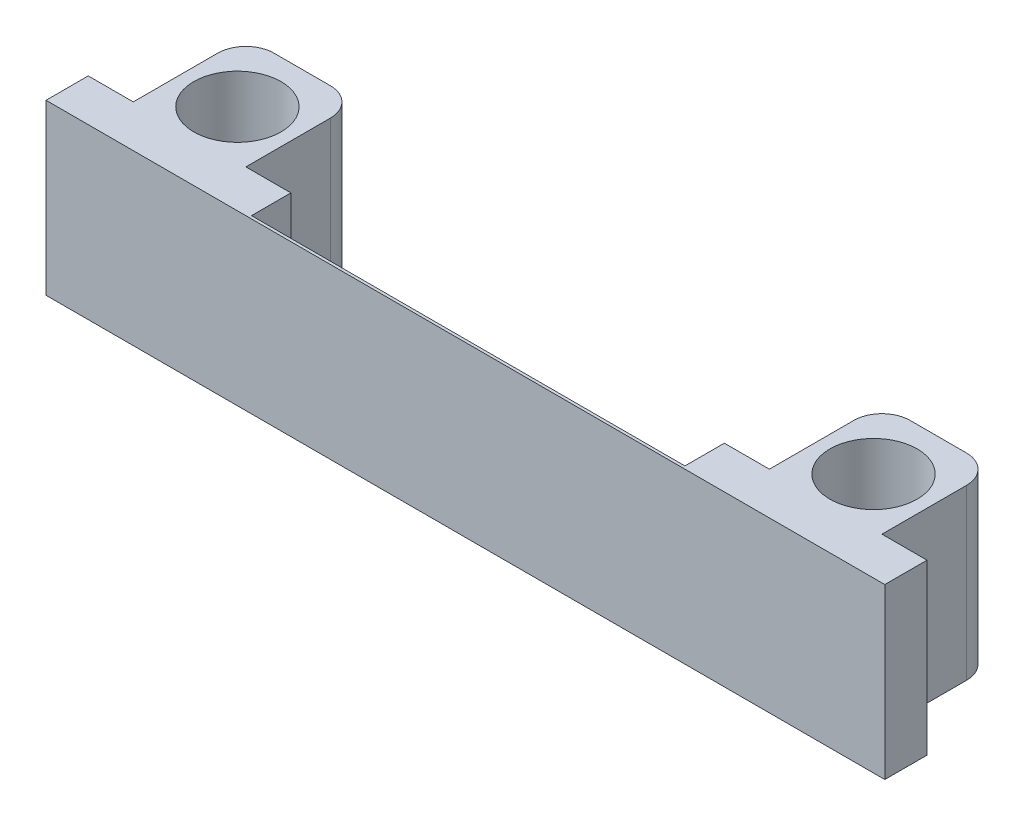
ISO-10303-21;
HEADER;
FILE_DESCRIPTION(('STEP AP214'),'2;1');
FILE_NAME('part.step','',(''),(''),'','','');
FILE_SCHEMA(('AUTOMOTIVE_DESIGN { 1 0 10303 214 1 1 1 1 }'));
ENDSEC;
DATA;
#1=APPLICATION_CONTEXT('core data for automotive mechanical design processes');
#2=APPLICATION_PROTOCOL_DEFINITION('international standard','automotive_design',2000,#1);
#3=PRODUCT_CONTEXT('',#1,'mechanical');
#4=PRODUCT('Part','Part','',(#3));
#5=PRODUCT_RELATED_PRODUCT_CATEGORY('part','',(#4));
#6=PRODUCT_DEFINITION_FORMATION('','',#4);
#7=PRODUCT_DEFINITION_CONTEXT('part definition',#1,'design');
#8=PRODUCT_DEFINITION('design','',#6,#7);
#9=PRODUCT_DEFINITION_SHAPE('','',#8);
#10=(LENGTH_UNIT() NAMED_UNIT(*) SI_UNIT(.MILLI.,.METRE.));
#11=(NAMED_UNIT(*) PLANE_ANGLE_UNIT() SI_UNIT($,.RADIAN.));
#12=(NAMED_UNIT(*) SI_UNIT($,.STERADIAN.) SOLID_ANGLE_UNIT());
#13=UNCERTAINTY_MEASURE_WITH_UNIT(LENGTH_MEASURE(1.E-05),#10,'distance_accuracy_value','');
#14=(GEOMETRIC_REPRESENTATION_CONTEXT(3) GLOBAL_UNCERTAINTY_ASSIGNED_CONTEXT((#13)) GLOBAL_UNIT_ASSIGNED_CONTEXT((#10,
#11,#12)) REPRESENTATION_CONTEXT('',''));
#15=CARTESIAN_POINT('',(0.,0.,0.));
#16=DIRECTION('',(0.,0.,1.));
#17=DIRECTION('',(1.,0.,0.));
#18=AXIS2_PLACEMENT_3D('',#15,#16,#17);
#19=CARTESIAN_POINT('',(0.,0.,7.));
#20=DIRECTION('',(0.,0.,1.));
#21=DIRECTION('',(1.,0.,0.));
#22=AXIS2_PLACEMENT_3D('',#19,#20,#21);
#23=PLANE('',#22);
#24=DIRECTION('',(0.,-1.,0.));
#25=VECTOR('',#24,1.);
#26=CARTESIAN_POINT('',(98.1360946745562,30.,7.));
#27=LINE('',#26,#25);
#28=CARTESIAN_POINT('',(98.1360946745562,30.,7.));
#29=VERTEX_POINT('',#28);
#30=CARTESIAN_POINT('',(98.1360946745562,0.,7.));
#31=VERTEX_POINT('',#30);
#32=EDGE_CURVE('E187',#29,#31,#27,.T.);
#33=ORIENTED_EDGE('',*,*,#32,.T.);
#34=DIRECTION('',(1.,0.,0.));
#35=VECTOR('',#34,1.);
#36=CARTESIAN_POINT('',(-14.8639053254438,0.,7.));
#37=LINE('',#36,#35);
#38=CARTESIAN_POINT('',(21.1360946745562,0.,7.));
#39=VERTEX_POINT('',#38);
#40=EDGE_CURVE('E200',#39,#31,#37,.T.);
#41=ORIENTED_EDGE('',*,*,#40,.F.);
#42=DIRECTION('',(0.,1.,0.));
#43=VECTOR('',#42,1.);
#44=CARTESIAN_POINT('',(21.1360946745562,30.,7.));
#45=LINE('',#44,#43);
#46=CARTESIAN_POINT('',(21.1360946745562,30.,7.));
#47=VERTEX_POINT('',#46);
#48=EDGE_CURVE('E225',#39,#47,#45,.T.);
#49=ORIENTED_EDGE('',*,*,#48,.T.);
#50=DIRECTION('',(-1.,0.,0.));
#51=VECTOR('',#50,1.);
#52=CARTESIAN_POINT('',(-14.8639053254438,30.,7.));
#53=LINE('',#52,#51);
#54=EDGE_CURVE('E201',#29,#47,#53,.T.);
#55=ORIENTED_EDGE('',*,*,#54,.F.);
#56=EDGE_LOOP('',(#33,#41,#49,#55));
#57=FACE_BOUND('',#56,.T.);
#58=ADVANCED_FACE('F42',(#57),#23,.F.);
#59=CARTESIAN_POINT('',(-14.8639053254438,30.,3.));
#60=DIRECTION('',(1.,0.,0.));
#61=DIRECTION('',(0.,0.,-1.));
#62=AXIS2_PLACEMENT_3D('',#59,#60,#61);
#63=PLANE('',#62);
#64=DIRECTION('',(0.,0.,1.));
#65=VECTOR('',#64,1.);
#66=CARTESIAN_POINT('',(-14.8639053254438,0.,3.));
#67=LINE('',#66,#65);
#68=CARTESIAN_POINT('',(-14.8639053254438,0.,0.));
#69=VERTEX_POINT('',#68);
#70=CARTESIAN_POINT('',(-14.8639053254438,0.,7.5));
#71=VERTEX_POINT('',#70);
#72=EDGE_CURVE('E231',#69,#71,#67,.T.);
#73=ORIENTED_EDGE('',*,*,#72,.T.);
#74=DIRECTION('',(0.,-1.,0.));
#75=VECTOR('',#74,1.);
#76=CARTESIAN_POINT('',(-14.8639053254438,30.,7.5));
#77=LINE('',#76,#75);
#78=CARTESIAN_POINT('',(-14.8639053254438,30.,7.5));
#79=VERTEX_POINT('',#78);
#80=EDGE_CURVE('E212',#79,#71,#77,.T.);
#81=ORIENTED_EDGE('',*,*,#80,.F.);
#82=DIRECTION('',(0.,0.,1.));
#83=VECTOR('',#82,1.);
#84=CARTESIAN_POINT('',(-14.8639053254438,30.,3.));
#85=LINE('',#84,#83);
#86=CARTESIAN_POINT('',(-14.8639053254438,30.,0.));
#87=VERTEX_POINT('',#86);
#88=EDGE_CURVE('E234',#87,#79,#85,.T.);
#89=ORIENTED_EDGE('',*,*,#88,.F.);
#90=DIRECTION('',(0.,-1.,0.));
#91=VECTOR('',#90,1.);
#92=CARTESIAN_POINT('',(-14.8639053254438,30.,0.));
#93=LINE('',#92,#91);
#94=EDGE_CURVE('E249',#87,#69,#93,.T.);
#95=ORIENTED_EDGE('',*,*,#94,.T.);
#96=EDGE_LOOP('',(#73,#81,#89,#95));
#97=FACE_BOUND('',#96,.T.);
#98=ADVANCED_FACE('F369',(#97),#63,.F.);
#99=CARTESIAN_POINT('',(21.1360946745562,30.,0.));
#100=DIRECTION('',(-1.,0.,0.));
#101=DIRECTION('',(0.,0.,1.));
#102=AXIS2_PLACEMENT_3D('',#99,#100,#101);
#103=PLANE('',#102);
#104=DIRECTION('',(0.,0.,-1.));
#105=VECTOR('',#104,1.);
#106=CARTESIAN_POINT('',(21.1360946745562,0.,0.));
#107=LINE('',#106,#105);
#108=CARTESIAN_POINT('',(21.1360946745562,0.,0.));
#109=VERTEX_POINT('',#108);
#110=EDGE_CURVE('E208',#39,#109,#107,.T.);
#111=ORIENTED_EDGE('',*,*,#110,.T.);
#112=DIRECTION('',(0.,-1.,0.));
#113=VECTOR('',#112,1.);
#114=CARTESIAN_POINT('',(21.1360946745562,30.,0.));
#115=LINE('',#114,#113);
#116=CARTESIAN_POINT('',(21.1360946745562,30.,0.));
#117=VERTEX_POINT('',#116);
#118=EDGE_CURVE('E270',#117,#109,#115,.T.);
#119=ORIENTED_EDGE('',*,*,#118,.F.);
#120=DIRECTION('',(0.,0.,-1.));
#121=VECTOR('',#120,1.);
#122=CARTESIAN_POINT('',(21.1360946745562,30.,0.));
#123=LINE('',#122,#121);
#124=EDGE_CURVE('E236',#47,#117,#123,.T.);
#125=ORIENTED_EDGE('',*,*,#124,.F.);
#126=ORIENTED_EDGE('',*,*,#48,.F.);
#127=EDGE_LOOP('',(#111,#119,#125,#126));
#128=FACE_BOUND('',#127,.T.);
#129=ADVANCED_FACE('F302',(#128),#103,.F.);
#130=CARTESIAN_POINT('',(13.1360946745562,30.,0.));
#131=DIRECTION('',(0.,0.,1.));
#132=DIRECTION('',(1.,0.,0.));
#133=AXIS2_PLACEMENT_3D('',#130,#131,#132);
#134=PLANE('',#133);
#135=DIRECTION('',(-1.,0.,0.));
#136=VECTOR('',#135,1.);
#137=CARTESIAN_POINT('',(13.1360946745562,0.,0.));
#138=LINE('',#137,#136);
#139=CARTESIAN_POINT('',(13.1360946745562,0.,0.));
#140=VERTEX_POINT('',#139);
#141=EDGE_CURVE('E252',#109,#140,#138,.T.);
#142=ORIENTED_EDGE('',*,*,#141,.T.);
#143=DIRECTION('',(0.,-1.,0.));
#144=VECTOR('',#143,1.);
#145=CARTESIAN_POINT('',(13.1360946745562,30.,0.));
#146=LINE('',#145,#144);
#147=CARTESIAN_POINT('',(13.1360946745562,30.,0.));
#148=VERTEX_POINT('',#147);
#149=EDGE_CURVE('E267',#148,#140,#146,.T.);
#150=ORIENTED_EDGE('',*,*,#149,.F.);
#151=DIRECTION('',(-1.,0.,0.));
#152=VECTOR('',#151,1.);
#153=CARTESIAN_POINT('',(13.1360946745562,30.,0.));
#154=LINE('',#153,#152);
#155=EDGE_CURVE('E239',#117,#148,#154,.T.);
#156=ORIENTED_EDGE('',*,*,#155,.F.);
#157=ORIENTED_EDGE('',*,*,#118,.T.);
#158=EDGE_LOOP('',(#142,#150,#156,#157));
#159=FACE_BOUND('',#158,.T.);
#160=ADVANCED_FACE('F298',(#159),#134,.F.);
#161=CARTESIAN_POINT('',(13.1360946745562,30.,-20.));
#162=DIRECTION('',(-1.,0.,0.));
#163=DIRECTION('',(0.,0.,1.));
#164=AXIS2_PLACEMENT_3D('',#161,#162,#163);
#165=PLANE('',#164);
#166=DIRECTION('',(0.,0.,-1.));
#167=VECTOR('',#166,1.);
#168=CARTESIAN_POINT('',(13.1360946745562,0.,-20.));
#169=LINE('',#168,#167);
#170=CARTESIAN_POINT('',(13.1360946745562,0.,-15.));
#171=VERTEX_POINT('',#170);
#172=EDGE_CURVE('E254',#140,#171,#169,.T.);
#173=ORIENTED_EDGE('',*,*,#172,.T.);
#174=DIRECTION('',(0.,-1.,0.));
#175=VECTOR('',#174,1.);
#176=CARTESIAN_POINT('',(13.1360946745562,30.,-15.));
#177=LINE('',#176,#175);
#178=CARTESIAN_POINT('',(13.1360946745562,30.,-15.));
#179=VERTEX_POINT('',#178);
#180=EDGE_CURVE('E65',#171,#179,#177,.F.);
#181=ORIENTED_EDGE('',*,*,#180,.T.);
#182=DIRECTION('',(0.,0.,-1.));
#183=VECTOR('',#182,1.);
#184=CARTESIAN_POINT('',(13.1360946745562,30.,-20.));
#185=LINE('',#184,#183);
#186=EDGE_CURVE('E241',#148,#179,#185,.T.);
#187=ORIENTED_EDGE('',*,*,#186,.F.);
#188=ORIENTED_EDGE('',*,*,#149,.T.);
#189=EDGE_LOOP('',(#173,#181,#187,#188));
#190=FACE_BOUND('',#189,.T.);
#191=ADVANCED_FACE('F294',(#190),#165,.F.);
#192=CARTESIAN_POINT('',(-6.86390532544379,30.,-20.));
#193=DIRECTION('',(0.,0.,1.));
#194=DIRECTION('',(1.,0.,0.));
#195=AXIS2_PLACEMENT_3D('',#192,#193,#194);
#196=PLANE('',#195);
#197=DIRECTION('',(-1.,0.,0.));
#198=VECTOR('',#197,1.);
#199=CARTESIAN_POINT('',(-6.86390532544379,30.,-20.));
#200=LINE('',#199,#198);
#201=CARTESIAN_POINT('',(8.13609467455621,30.,-20.));
#202=VERTEX_POINT('',#201);
#203=CARTESIAN_POINT('',(-1.86390532544379,30.,-20.));
#204=VERTEX_POINT('',#203);
#205=EDGE_CURVE('E243',#202,#204,#200,.T.);
#206=ORIENTED_EDGE('',*,*,#205,.F.);
#207=DIRECTION('',(0.,-1.,0.));
#208=VECTOR('',#207,1.);
#209=CARTESIAN_POINT('',(8.13609467455621,30.,-20.));
#210=LINE('',#209,#208);
#211=CARTESIAN_POINT('',(8.13609467455621,0.,-20.));
#212=VERTEX_POINT('',#211);
#213=EDGE_CURVE('E275',#202,#212,#210,.T.);
#214=ORIENTED_EDGE('',*,*,#213,.T.);
#215=DIRECTION('',(-1.,0.,0.));
#216=VECTOR('',#215,1.);
#217=CARTESIAN_POINT('',(-6.86390532544379,0.,-20.));
#218=LINE('',#217,#216);
#219=CARTESIAN_POINT('',(-1.86390532544379,0.,-20.));
#220=VERTEX_POINT('',#219);
#221=EDGE_CURVE('E256',#212,#220,#218,.T.);
#222=ORIENTED_EDGE('',*,*,#221,.T.);
#223=DIRECTION('',(0.,-1.,0.));
#224=VECTOR('',#223,1.);
#225=CARTESIAN_POINT('',(-1.86390532544379,30.,-20.));
#226=LINE('',#225,#224);
#227=EDGE_CURVE('E273',#220,#204,#226,.F.);
#228=ORIENTED_EDGE('',*,*,#227,.T.);
#229=EDGE_LOOP('',(#206,#214,#222,#228));
#230=FACE_BOUND('',#229,.T.);
#231=ADVANCED_FACE('F290',(#230),#196,.F.);
#232=CARTESIAN_POINT('',(-6.86390532544379,30.,0.));
#233=DIRECTION('',(1.,0.,0.));
#234=DIRECTION('',(0.,0.,-1.));
#235=AXIS2_PLACEMENT_3D('',#232,#233,#234);
#236=PLANE('',#235);
#237=DIRECTION('',(0.,0.,1.));
#238=VECTOR('',#237,1.);
#239=CARTESIAN_POINT('',(-6.86390532544379,30.,0.));
#240=LINE('',#239,#238);
#241=CARTESIAN_POINT('',(-6.86390532544379,30.,-15.));
#242=VERTEX_POINT('',#241);
#243=CARTESIAN_POINT('',(-6.86390532544379,30.,0.));
#244=VERTEX_POINT('',#243);
#245=EDGE_CURVE('E245',#242,#244,#240,.T.);
#246=ORIENTED_EDGE('',*,*,#245,.F.);
#247=DIRECTION('',(0.,-1.,0.));
#248=VECTOR('',#247,1.);
#249=CARTESIAN_POINT('',(-6.86390532544379,30.,-15.));
#250=LINE('',#249,#248);
#251=CARTESIAN_POINT('',(-6.86390532544379,0.,-15.));
#252=VERTEX_POINT('',#251);
#253=EDGE_CURVE('E11',#242,#252,#250,.T.);
#254=ORIENTED_EDGE('',*,*,#253,.T.);
#255=DIRECTION('',(0.,0.,1.));
#256=VECTOR('',#255,1.);
#257=CARTESIAN_POINT('',(-6.86390532544379,0.,0.));
#258=LINE('',#257,#256);
#259=CARTESIAN_POINT('',(-6.86390532544379,0.,0.));
#260=VERTEX_POINT('',#259);
#261=EDGE_CURVE('E259',#252,#260,#258,.T.);
#262=ORIENTED_EDGE('',*,*,#261,.T.);
#263=DIRECTION('',(0.,-1.,0.));
#264=VECTOR('',#263,1.);
#265=CARTESIAN_POINT('',(-6.86390532544379,30.,0.));
#266=LINE('',#265,#264);
#267=EDGE_CURVE('E264',#244,#260,#266,.T.);
#268=ORIENTED_EDGE('',*,*,#267,.F.);
#269=EDGE_LOOP('',(#246,#254,#262,#268));
#270=FACE_BOUND('',#269,.T.);
#271=ADVANCED_FACE('F443',(#270),#236,.F.);
#272=CARTESIAN_POINT('',(-14.8639053254438,30.,0.));
#273=DIRECTION('',(0.,0.,1.));
#274=DIRECTION('',(1.,0.,0.));
#275=AXIS2_PLACEMENT_3D('',#272,#273,#274);
#276=PLANE('',#275);
#277=DIRECTION('',(-1.,0.,0.));
#278=VECTOR('',#277,1.);
#279=CARTESIAN_POINT('',(-14.8639053254438,0.,0.));
#280=LINE('',#279,#278);
#281=EDGE_CURVE('E237',#260,#69,#280,.T.);
#282=ORIENTED_EDGE('',*,*,#281,.T.);
#283=ORIENTED_EDGE('',*,*,#94,.F.);
#284=DIRECTION('',(-1.,0.,0.));
#285=VECTOR('',#284,1.);
#286=CARTESIAN_POINT('',(-14.8639053254438,30.,0.));
#287=LINE('',#286,#285);
#288=EDGE_CURVE('E247',#244,#87,#287,.T.);
#289=ORIENTED_EDGE('',*,*,#288,.F.);
#290=ORIENTED_EDGE('',*,*,#267,.T.);
#291=EDGE_LOOP('',(#282,#283,#289,#290));
#292=FACE_BOUND('',#291,.T.);
#293=ADVANCED_FACE('F436',(#292),#276,.F.);
#294=CARTESIAN_POINT('',(0.,30.,0.));
#295=DIRECTION('',(0.,-1.,0.));
#296=DIRECTION('',(0.,0.,-1.));
#297=AXIS2_PLACEMENT_3D('',#294,#295,#296);
#298=PLANE('',#297);
#299=CARTESIAN_POINT('',(3.13609467455622,30.,-8.49999999999999));
#300=DIRECTION('',(0.,-1.,0.));
#301=DIRECTION('',(0.,0.,-1.));
#302=AXIS2_PLACEMENT_3D('',#299,#300,#301);
#303=CIRCLE('',#302,7.75);
#304=CARTESIAN_POINT('',(3.13609467455622,30.,-16.25));
#305=VERTEX_POINT('',#304);
#306=EDGE_CURVE('E228',#305,#305,#303,.T.);
#307=ORIENTED_EDGE('',*,*,#306,.T.);
#308=EDGE_LOOP('',(#307));
#309=FACE_BOUND('',#308,.T.);
#310=ORIENTED_EDGE('',*,*,#186,.T.);
#311=CARTESIAN_POINT('',(8.13609467455621,30.,-15.));
#312=DIRECTION('',(0.,-1.,0.));
#313=DIRECTION('',(0.,0.,-1.));
#314=AXIS2_PLACEMENT_3D('',#311,#312,#313);
#315=CIRCLE('',#314,5.);
#316=EDGE_CURVE('E50',#179,#202,#315,.F.);
#317=ORIENTED_EDGE('',*,*,#316,.T.);
#318=ORIENTED_EDGE('',*,*,#205,.T.);
#319=CARTESIAN_POINT('',(-1.86390532544379,30.,-15.));
#320=DIRECTION('',(0.,-1.,0.));
#321=DIRECTION('',(0.,0.,-1.));
#322=AXIS2_PLACEMENT_3D('',#319,#320,#321);
#323=CIRCLE('',#322,5.);
#324=EDGE_CURVE('E57',#204,#242,#323,.F.);
#325=ORIENTED_EDGE('',*,*,#324,.T.);
#326=ORIENTED_EDGE('',*,*,#245,.T.);
#327=ORIENTED_EDGE('',*,*,#288,.T.);
#328=ORIENTED_EDGE('',*,*,#88,.T.);
#329=DIRECTION('',(-1.,0.,0.));
#330=VECTOR('',#329,1.);
#331=CARTESIAN_POINT('',(-14.8639053254438,30.,7.5));
#332=LINE('',#331,#330);
#333=CARTESIAN_POINT('',(134.136094674556,30.,7.5));
#334=VERTEX_POINT('',#333);
#335=EDGE_CURVE('E218',#334,#79,#332,.T.);
#336=ORIENTED_EDGE('',*,*,#335,.F.);
#337=DIRECTION('',(0.,0.,-1.));
#338=VECTOR('',#337,1.);
#339=CARTESIAN_POINT('',(134.136094674556,30.,7.5));
#340=LINE('',#339,#338);
#341=CARTESIAN_POINT('',(134.136094674556,30.,0.));
#342=VERTEX_POINT('',#341);
#343=EDGE_CURVE('E221',#334,#342,#340,.T.);
#344=ORIENTED_EDGE('',*,*,#343,.T.);
#345=DIRECTION('',(-1.,0.,0.));
#346=VECTOR('',#345,1.);
#347=CARTESIAN_POINT('',(126.136094674556,30.,0.));
#348=LINE('',#347,#346);
#349=CARTESIAN_POINT('',(126.136094674556,30.,0.));
#350=VERTEX_POINT('',#349);
#351=EDGE_CURVE('E306',#342,#350,#348,.T.);
#352=ORIENTED_EDGE('',*,*,#351,.T.);
#353=DIRECTION('',(0.,0.,-1.));
#354=VECTOR('',#353,1.);
#355=CARTESIAN_POINT('',(126.136094674556,30.,-20.));
#356=LINE('',#355,#354);
#357=CARTESIAN_POINT('',(126.136094674556,30.,-15.));
#358=VERTEX_POINT('',#357);
#359=EDGE_CURVE('E309',#350,#358,#356,.T.);
#360=ORIENTED_EDGE('',*,*,#359,.T.);
#361=CARTESIAN_POINT('',(121.136094674556,30.,-15.));
#362=DIRECTION('',(0.,-1.,0.));
#363=DIRECTION('',(0.,0.,-1.));
#364=AXIS2_PLACEMENT_3D('',#361,#362,#363);
#365=CIRCLE('',#364,5.);
#366=CARTESIAN_POINT('',(121.136094674556,30.,-20.));
#367=VERTEX_POINT('',#366);
#368=EDGE_CURVE('E215',#358,#367,#365,.F.);
#369=ORIENTED_EDGE('',*,*,#368,.T.);
#370=DIRECTION('',(-1.,0.,0.));
#371=VECTOR('',#370,1.);
#372=CARTESIAN_POINT('',(106.136094674556,30.,-20.));
#373=LINE('',#372,#371);
#374=CARTESIAN_POINT('',(111.136094674556,30.,-20.));
#375=VERTEX_POINT('',#374);
#376=EDGE_CURVE('E318',#367,#375,#373,.T.);
#377=ORIENTED_EDGE('',*,*,#376,.T.);
#378=CARTESIAN_POINT('',(111.136094674556,30.,-15.));
#379=DIRECTION('',(0.,-1.,0.));
#380=DIRECTION('',(0.,0.,-1.));
#381=AXIS2_PLACEMENT_3D('',#378,#379,#380);
#382=CIRCLE('',#381,5.);
#383=CARTESIAN_POINT('',(106.136094674556,30.,-15.));
#384=VERTEX_POINT('',#383);
#385=EDGE_CURVE('E353',#375,#384,#382,.F.);
#386=ORIENTED_EDGE('',*,*,#385,.T.);
#387=DIRECTION('',(0.,0.,1.));
#388=VECTOR('',#387,1.);
#389=CARTESIAN_POINT('',(106.136094674556,30.,0.));
#390=LINE('',#389,#388);
#391=CARTESIAN_POINT('',(106.136094674556,30.,0.));
#392=VERTEX_POINT('',#391);
#393=EDGE_CURVE('E321',#384,#392,#390,.T.);
#394=ORIENTED_EDGE('',*,*,#393,.T.);
#395=DIRECTION('',(-1.,0.,0.));
#396=VECTOR('',#395,1.);
#397=CARTESIAN_POINT('',(98.1360946745562,30.,0.));
#398=LINE('',#397,#396);
#399=CARTESIAN_POINT('',(98.1360946745562,30.,0.));
#400=VERTEX_POINT('',#399);
#401=EDGE_CURVE('E305',#392,#400,#398,.T.);
#402=ORIENTED_EDGE('',*,*,#401,.T.);
#403=DIRECTION('',(0.,0.,1.));
#404=VECTOR('',#403,1.);
#405=CARTESIAN_POINT('',(98.1360946745562,30.,3.));
#406=LINE('',#405,#404);
#407=EDGE_CURVE('E303',#400,#29,#406,.T.);
#408=ORIENTED_EDGE('',*,*,#407,.T.);
#409=ORIENTED_EDGE('',*,*,#54,.T.);
#410=ORIENTED_EDGE('',*,*,#124,.T.);
#411=ORIENTED_EDGE('',*,*,#155,.T.);
#412=EDGE_LOOP('',(#310,#317,#318,#325,#326,#327,#328,#336,#344,#352,#360,#369,#377,#386,#394,
#402,#408,#409,#410,#411));
#413=FACE_BOUND('',#412,.T.);
#414=CARTESIAN_POINT('',(116.136094674556,30.,-8.49999999999999));
#415=DIRECTION('',(0.,-1.,0.));
#416=DIRECTION('',(0.,0.,-1.));
#417=AXIS2_PLACEMENT_3D('',#414,#415,#416);
#418=CIRCLE('',#417,7.75);
#419=CARTESIAN_POINT('',(116.136094674556,30.,-16.25));
#420=VERTEX_POINT('',#419);
#421=EDGE_CURVE('E195',#420,#420,#418,.T.);
#422=ORIENTED_EDGE('',*,*,#421,.T.);
#423=EDGE_LOOP('',(#422));
#424=FACE_BOUND('',#423,.T.);
#425=ADVANCED_FACE('F285',(#309,#413,#424),#298,.F.);
#426=CARTESIAN_POINT('',(0.,0.,0.));
#427=DIRECTION('',(0.,-1.,0.));
#428=DIRECTION('',(0.,0.,-1.));
#429=AXIS2_PLACEMENT_3D('',#426,#427,#428);
#430=PLANE('',#429);
#431=CARTESIAN_POINT('',(3.13609467455622,0.,-8.49999999999999));
#432=DIRECTION('',(0.,-1.,0.));
#433=DIRECTION('',(0.,0.,-1.));
#434=AXIS2_PLACEMENT_3D('',#431,#432,#433);
#435=CIRCLE('',#434,7.75);
#436=CARTESIAN_POINT('',(3.13609467455622,0.,-16.25));
#437=VERTEX_POINT('',#436);
#438=EDGE_CURVE('E227',#437,#437,#435,.T.);
#439=ORIENTED_EDGE('',*,*,#438,.F.);
#440=EDGE_LOOP('',(#439));
#441=FACE_BOUND('',#440,.T.);
#442=ORIENTED_EDGE('',*,*,#221,.F.);
#443=CARTESIAN_POINT('',(8.13609467455621,0.,-15.));
#444=DIRECTION('',(0.,-1.,0.));
#445=DIRECTION('',(0.,0.,-1.));
#446=AXIS2_PLACEMENT_3D('',#443,#444,#445);
#447=CIRCLE('',#446,5.);
#448=EDGE_CURVE('E280',#212,#171,#447,.T.);
#449=ORIENTED_EDGE('',*,*,#448,.T.);
#450=ORIENTED_EDGE('',*,*,#172,.F.);
#451=ORIENTED_EDGE('',*,*,#141,.F.);
#452=ORIENTED_EDGE('',*,*,#110,.F.);
#453=ORIENTED_EDGE('',*,*,#40,.T.);
#454=DIRECTION('',(0.,0.,1.));
#455=VECTOR('',#454,1.);
#456=CARTESIAN_POINT('',(98.1360946745562,0.,3.));
#457=LINE('',#456,#455);
#458=CARTESIAN_POINT('',(98.1360946745562,0.,0.));
#459=VERTEX_POINT('',#458);
#460=EDGE_CURVE('E183',#459,#31,#457,.T.);
#461=ORIENTED_EDGE('',*,*,#460,.F.);
#462=DIRECTION('',(-1.,0.,0.));
#463=VECTOR('',#462,1.);
#464=CARTESIAN_POINT('',(98.1360946745562,0.,0.));
#465=LINE('',#464,#463);
#466=CARTESIAN_POINT('',(106.136094674556,0.,0.));
#467=VERTEX_POINT('',#466);
#468=EDGE_CURVE('E307',#467,#459,#465,.T.);
#469=ORIENTED_EDGE('',*,*,#468,.F.);
#470=DIRECTION('',(0.,0.,1.));
#471=VECTOR('',#470,1.);
#472=CARTESIAN_POINT('',(106.136094674556,0.,0.));
#473=LINE('',#472,#471);
#474=CARTESIAN_POINT('',(106.136094674556,0.,-15.));
#475=VERTEX_POINT('',#474);
#476=EDGE_CURVE('E311',#475,#467,#473,.T.);
#477=ORIENTED_EDGE('',*,*,#476,.F.);
#478=CARTESIAN_POINT('',(111.136094674556,0.,-15.));
#479=DIRECTION('',(0.,-1.,0.));
#480=DIRECTION('',(0.,0.,-1.));
#481=AXIS2_PLACEMENT_3D('',#478,#479,#480);
#482=CIRCLE('',#481,5.);
#483=CARTESIAN_POINT('',(111.136094674556,0.,-20.));
#484=VERTEX_POINT('',#483);
#485=EDGE_CURVE('E347',#475,#484,#482,.T.);
#486=ORIENTED_EDGE('',*,*,#485,.T.);
#487=DIRECTION('',(-1.,0.,0.));
#488=VECTOR('',#487,1.);
#489=CARTESIAN_POINT('',(106.136094674556,0.,-20.));
#490=LINE('',#489,#488);
#491=CARTESIAN_POINT('',(121.136094674556,0.,-20.));
#492=VERTEX_POINT('',#491);
#493=EDGE_CURVE('E328',#492,#484,#490,.T.);
#494=ORIENTED_EDGE('',*,*,#493,.F.);
#495=CARTESIAN_POINT('',(121.136094674556,0.,-15.));
#496=DIRECTION('',(0.,-1.,0.));
#497=DIRECTION('',(0.,0.,-1.));
#498=AXIS2_PLACEMENT_3D('',#495,#496,#497);
#499=CIRCLE('',#498,5.);
#500=CARTESIAN_POINT('',(126.136094674556,0.,-15.));
#501=VERTEX_POINT('',#500);
#502=EDGE_CURVE('E349',#492,#501,#499,.T.);
#503=ORIENTED_EDGE('',*,*,#502,.T.);
#504=DIRECTION('',(0.,0.,-1.));
#505=VECTOR('',#504,1.);
#506=CARTESIAN_POINT('',(126.136094674556,0.,-20.));
#507=LINE('',#506,#505);
#508=CARTESIAN_POINT('',(126.136094674556,0.,0.));
#509=VERTEX_POINT('',#508);
#510=EDGE_CURVE('E325',#509,#501,#507,.T.);
#511=ORIENTED_EDGE('',*,*,#510,.F.);
#512=DIRECTION('',(-1.,0.,0.));
#513=VECTOR('',#512,1.);
#514=CARTESIAN_POINT('',(126.136094674556,0.,0.));
#515=LINE('',#514,#513);
#516=CARTESIAN_POINT('',(134.136094674556,0.,0.));
#517=VERTEX_POINT('',#516);
#518=EDGE_CURVE('E194',#517,#509,#515,.T.);
#519=ORIENTED_EDGE('',*,*,#518,.F.);
#520=DIRECTION('',(0.,0.,-1.));
#521=VECTOR('',#520,1.);
#522=CARTESIAN_POINT('',(134.136094674556,0.,7.5));
#523=LINE('',#522,#521);
#524=CARTESIAN_POINT('',(134.136094674556,0.,7.5));
#525=VERTEX_POINT('',#524);
#526=EDGE_CURVE('E223',#525,#517,#523,.T.);
#527=ORIENTED_EDGE('',*,*,#526,.F.);
#528=DIRECTION('',(1.,0.,0.));
#529=VECTOR('',#528,1.);
#530=CARTESIAN_POINT('',(-14.8639053254438,0.,7.5));
#531=LINE('',#530,#529);
#532=EDGE_CURVE('E358',#71,#525,#531,.T.);
#533=ORIENTED_EDGE('',*,*,#532,.F.);
#534=ORIENTED_EDGE('',*,*,#72,.F.);
#535=ORIENTED_EDGE('',*,*,#281,.F.);
#536=ORIENTED_EDGE('',*,*,#261,.F.);
#537=CARTESIAN_POINT('',(-1.86390532544379,0.,-15.));
#538=DIRECTION('',(0.,-1.,0.));
#539=DIRECTION('',(0.,0.,-1.));
#540=AXIS2_PLACEMENT_3D('',#537,#538,#539);
#541=CIRCLE('',#540,5.);
#542=EDGE_CURVE('E278',#252,#220,#541,.T.);
#543=ORIENTED_EDGE('',*,*,#542,.T.);
#544=EDGE_LOOP('',(#442,#449,#450,#451,#452,#453,#461,#469,#477,#486,#494,#503,#511,#519,#527,
#533,#534,#535,#536,#543));
#545=FACE_BOUND('',#544,.T.);
#546=CARTESIAN_POINT('',(116.136094674556,0.,-8.49999999999999));
#547=DIRECTION('',(0.,-1.,0.));
#548=DIRECTION('',(0.,0.,-1.));
#549=AXIS2_PLACEMENT_3D('',#546,#547,#548);
#550=CIRCLE('',#549,7.75);
#551=CARTESIAN_POINT('',(116.136094674556,0.,-16.25));
#552=VERTEX_POINT('',#551);
#553=EDGE_CURVE('E202',#552,#552,#550,.T.);
#554=ORIENTED_EDGE('',*,*,#553,.F.);
#555=EDGE_LOOP('',(#554));
#556=FACE_BOUND('',#555,.T.);
#557=ADVANCED_FACE('F205',(#441,#545,#556),#430,.T.);
#558=CARTESIAN_POINT('',(3.13609467455622,30.,-8.49999999999999));
#559=DIRECTION('',(0.,-1.,0.));
#560=DIRECTION('',(0.,0.,-1.));
#561=AXIS2_PLACEMENT_3D('',#558,#559,#560);
#562=CYLINDRICAL_SURFACE('',#561,7.75);
#563=ORIENTED_EDGE('',*,*,#306,.F.);
#564=EDGE_LOOP('',(#563));
#565=FACE_BOUND('',#564,.T.);
#566=ORIENTED_EDGE('',*,*,#438,.T.);
#567=EDGE_LOOP('',(#566));
#568=FACE_BOUND('',#567,.T.);
#569=ADVANCED_FACE('F430',(#565,#568),#562,.F.);
#570=CARTESIAN_POINT('',(8.13609467455621,30.,-15.));
#571=DIRECTION('',(0.,-1.,0.));
#572=DIRECTION('',(0.,0.,-1.));
#573=AXIS2_PLACEMENT_3D('',#570,#571,#572);
#574=CYLINDRICAL_SURFACE('',#573,5.);
#575=ORIENTED_EDGE('',*,*,#316,.F.);
#576=ORIENTED_EDGE('',*,*,#180,.F.);
#577=ORIENTED_EDGE('',*,*,#448,.F.);
#578=ORIENTED_EDGE('',*,*,#213,.F.);
#579=EDGE_LOOP('',(#575,#576,#577,#578));
#580=FACE_BOUND('',#579,.T.);
#581=ADVANCED_FACE('F292',(#580),#574,.T.);
#582=CARTESIAN_POINT('',(-1.86390532544379,30.,-15.));
#583=DIRECTION('',(0.,-1.,0.));
#584=DIRECTION('',(0.,0.,-1.));
#585=AXIS2_PLACEMENT_3D('',#582,#583,#584);
#586=CYLINDRICAL_SURFACE('',#585,5.);
#587=ORIENTED_EDGE('',*,*,#324,.F.);
#588=ORIENTED_EDGE('',*,*,#227,.F.);
#589=ORIENTED_EDGE('',*,*,#542,.F.);
#590=ORIENTED_EDGE('',*,*,#253,.F.);
#591=EDGE_LOOP('',(#587,#588,#589,#590));
#592=FACE_BOUND('',#591,.T.);
#593=ADVANCED_FACE('F44',(#592),#586,.T.);
#594=CARTESIAN_POINT('',(134.136094674556,30.,7.5));
#595=DIRECTION('',(-1.,0.,0.));
#596=DIRECTION('',(0.,0.,1.));
#597=AXIS2_PLACEMENT_3D('',#594,#595,#596);
#598=PLANE('',#597);
#599=ORIENTED_EDGE('',*,*,#526,.T.);
#600=DIRECTION('',(0.,-1.,0.));
#601=VECTOR('',#600,1.);
#602=CARTESIAN_POINT('',(134.136094674556,30.,0.));
#603=LINE('',#602,#601);
#604=EDGE_CURVE('E339',#342,#517,#603,.T.);
#605=ORIENTED_EDGE('',*,*,#604,.F.);
#606=ORIENTED_EDGE('',*,*,#343,.F.);
#607=DIRECTION('',(0.,1.,0.));
#608=VECTOR('',#607,1.);
#609=CARTESIAN_POINT('',(134.136094674556,30.,7.5));
#610=LINE('',#609,#608);
#611=EDGE_CURVE('E359',#525,#334,#610,.T.);
#612=ORIENTED_EDGE('',*,*,#611,.F.);
#613=EDGE_LOOP('',(#599,#605,#606,#612));
#614=FACE_BOUND('',#613,.T.);
#615=ADVANCED_FACE('F379',(#614),#598,.F.);
#616=CARTESIAN_POINT('',(0.,0.,7.5));
#617=DIRECTION('',(0.,0.,1.));
#618=DIRECTION('',(1.,0.,0.));
#619=AXIS2_PLACEMENT_3D('',#616,#617,#618);
#620=PLANE('',#619);
#621=ORIENTED_EDGE('',*,*,#80,.T.);
#622=ORIENTED_EDGE('',*,*,#532,.T.);
#623=ORIENTED_EDGE('',*,*,#611,.T.);
#624=ORIENTED_EDGE('',*,*,#335,.T.);
#625=EDGE_LOOP('',(#621,#622,#623,#624));
#626=FACE_BOUND('',#625,.T.);
#627=ADVANCED_FACE('F366',(#626),#620,.T.);
#628=CARTESIAN_POINT('',(98.1360946745562,30.,3.));
#629=DIRECTION('',(1.,0.,0.));
#630=DIRECTION('',(0.,0.,-1.));
#631=AXIS2_PLACEMENT_3D('',#628,#629,#630);
#632=PLANE('',#631);
#633=ORIENTED_EDGE('',*,*,#460,.T.);
#634=ORIENTED_EDGE('',*,*,#32,.F.);
#635=ORIENTED_EDGE('',*,*,#407,.F.);
#636=DIRECTION('',(0.,-1.,0.));
#637=VECTOR('',#636,1.);
#638=CARTESIAN_POINT('',(98.1360946745562,30.,0.));
#639=LINE('',#638,#637);
#640=EDGE_CURVE('E190',#400,#459,#639,.T.);
#641=ORIENTED_EDGE('',*,*,#640,.T.);
#642=EDGE_LOOP('',(#633,#634,#635,#641));
#643=FACE_BOUND('',#642,.T.);
#644=ADVANCED_FACE('F185',(#643),#632,.F.);
#645=CARTESIAN_POINT('',(126.136094674556,30.,0.));
#646=DIRECTION('',(0.,0.,1.));
#647=DIRECTION('',(1.,0.,0.));
#648=AXIS2_PLACEMENT_3D('',#645,#646,#647);
#649=PLANE('',#648);
#650=ORIENTED_EDGE('',*,*,#518,.T.);
#651=DIRECTION('',(0.,-1.,0.));
#652=VECTOR('',#651,1.);
#653=CARTESIAN_POINT('',(126.136094674556,30.,0.));
#654=LINE('',#653,#652);
#655=EDGE_CURVE('E336',#350,#509,#654,.T.);
#656=ORIENTED_EDGE('',*,*,#655,.F.);
#657=ORIENTED_EDGE('',*,*,#351,.F.);
#658=ORIENTED_EDGE('',*,*,#604,.T.);
#659=EDGE_LOOP('',(#650,#656,#657,#658));
#660=FACE_BOUND('',#659,.T.);
#661=ADVANCED_FACE('F385',(#660),#649,.F.);
#662=CARTESIAN_POINT('',(126.136094674556,30.,-20.));
#663=DIRECTION('',(-1.,0.,0.));
#664=DIRECTION('',(0.,0.,1.));
#665=AXIS2_PLACEMENT_3D('',#662,#663,#664);
#666=PLANE('',#665);
#667=ORIENTED_EDGE('',*,*,#510,.T.);
#668=DIRECTION('',(0.,-1.,0.));
#669=VECTOR('',#668,1.);
#670=CARTESIAN_POINT('',(126.136094674556,30.,-15.));
#671=LINE('',#670,#669);
#672=EDGE_CURVE('E351',#501,#358,#671,.F.);
#673=ORIENTED_EDGE('',*,*,#672,.T.);
#674=ORIENTED_EDGE('',*,*,#359,.F.);
#675=ORIENTED_EDGE('',*,*,#655,.T.);
#676=EDGE_LOOP('',(#667,#673,#674,#675));
#677=FACE_BOUND('',#676,.T.);
#678=ADVANCED_FACE('F387',(#677),#666,.F.);
#679=CARTESIAN_POINT('',(106.136094674556,30.,-20.));
#680=DIRECTION('',(0.,0.,1.));
#681=DIRECTION('',(1.,0.,0.));
#682=AXIS2_PLACEMENT_3D('',#679,#680,#681);
#683=PLANE('',#682);
#684=ORIENTED_EDGE('',*,*,#376,.F.);
#685=DIRECTION('',(0.,-1.,0.));
#686=VECTOR('',#685,1.);
#687=CARTESIAN_POINT('',(121.136094674556,30.,-20.));
#688=LINE('',#687,#686);
#689=EDGE_CURVE('E344',#367,#492,#688,.T.);
#690=ORIENTED_EDGE('',*,*,#689,.T.);
#691=ORIENTED_EDGE('',*,*,#493,.T.);
#692=DIRECTION('',(0.,-1.,0.));
#693=VECTOR('',#692,1.);
#694=CARTESIAN_POINT('',(111.136094674556,30.,-20.));
#695=LINE('',#694,#693);
#696=EDGE_CURVE('E342',#484,#375,#695,.F.);
#697=ORIENTED_EDGE('',*,*,#696,.T.);
#698=EDGE_LOOP('',(#684,#690,#691,#697));
#699=FACE_BOUND('',#698,.T.);
#700=ADVANCED_FACE('F395',(#699),#683,.F.);
#701=CARTESIAN_POINT('',(106.136094674556,30.,0.));
#702=DIRECTION('',(1.,0.,0.));
#703=DIRECTION('',(0.,0.,-1.));
#704=AXIS2_PLACEMENT_3D('',#701,#702,#703);
#705=PLANE('',#704);
#706=ORIENTED_EDGE('',*,*,#393,.F.);
#707=DIRECTION('',(0.,-1.,0.));
#708=VECTOR('',#707,1.);
#709=CARTESIAN_POINT('',(106.136094674556,30.,-15.));
#710=LINE('',#709,#708);
#711=EDGE_CURVE('E210',#384,#475,#710,.T.);
#712=ORIENTED_EDGE('',*,*,#711,.T.);
#713=ORIENTED_EDGE('',*,*,#476,.T.);
#714=DIRECTION('',(0.,-1.,0.));
#715=VECTOR('',#714,1.);
#716=CARTESIAN_POINT('',(106.136094674556,30.,0.));
#717=LINE('',#716,#715);
#718=EDGE_CURVE('E333',#392,#467,#717,.T.);
#719=ORIENTED_EDGE('',*,*,#718,.F.);
#720=EDGE_LOOP('',(#706,#712,#713,#719));
#721=FACE_BOUND('',#720,.T.);
#722=ADVANCED_FACE('F404',(#721),#705,.F.);
#723=CARTESIAN_POINT('',(98.1360946745562,30.,0.));
#724=DIRECTION('',(0.,0.,1.));
#725=DIRECTION('',(1.,0.,0.));
#726=AXIS2_PLACEMENT_3D('',#723,#724,#725);
#727=PLANE('',#726);
#728=ORIENTED_EDGE('',*,*,#468,.T.);
#729=ORIENTED_EDGE('',*,*,#640,.F.);
#730=ORIENTED_EDGE('',*,*,#401,.F.);
#731=ORIENTED_EDGE('',*,*,#718,.T.);
#732=EDGE_LOOP('',(#728,#729,#730,#731));
#733=FACE_BOUND('',#732,.T.);
#734=ADVANCED_FACE('F407',(#733),#727,.F.);
#735=CARTESIAN_POINT('',(116.136094674556,30.,-8.49999999999999));
#736=DIRECTION('',(0.,-1.,0.));
#737=DIRECTION('',(0.,0.,-1.));
#738=AXIS2_PLACEMENT_3D('',#735,#736,#737);
#739=CYLINDRICAL_SURFACE('',#738,7.75);
#740=ORIENTED_EDGE('',*,*,#421,.F.);
#741=EDGE_LOOP('',(#740));
#742=FACE_BOUND('',#741,.T.);
#743=ORIENTED_EDGE('',*,*,#553,.T.);
#744=EDGE_LOOP('',(#743));
#745=FACE_BOUND('',#744,.T.);
#746=ADVANCED_FACE('F409',(#742,#745),#739,.F.);
#747=CARTESIAN_POINT('',(121.136094674556,30.,-15.));
#748=DIRECTION('',(0.,-1.,0.));
#749=DIRECTION('',(0.,0.,-1.));
#750=AXIS2_PLACEMENT_3D('',#747,#748,#749);
#751=CYLINDRICAL_SURFACE('',#750,5.);
#752=ORIENTED_EDGE('',*,*,#368,.F.);
#753=ORIENTED_EDGE('',*,*,#672,.F.);
#754=ORIENTED_EDGE('',*,*,#502,.F.);
#755=ORIENTED_EDGE('',*,*,#689,.F.);
#756=EDGE_LOOP('',(#752,#753,#754,#755));
#757=FACE_BOUND('',#756,.T.);
#758=ADVANCED_FACE('F390',(#757),#751,.T.);
#759=CARTESIAN_POINT('',(111.136094674556,30.,-15.));
#760=DIRECTION('',(0.,-1.,0.));
#761=DIRECTION('',(0.,0.,-1.));
#762=AXIS2_PLACEMENT_3D('',#759,#760,#761);
#763=CYLINDRICAL_SURFACE('',#762,5.);
#764=ORIENTED_EDGE('',*,*,#385,.F.);
#765=ORIENTED_EDGE('',*,*,#696,.F.);
#766=ORIENTED_EDGE('',*,*,#485,.F.);
#767=ORIENTED_EDGE('',*,*,#711,.F.);
#768=EDGE_LOOP('',(#764,#765,#766,#767));
#769=FACE_BOUND('',#768,.T.);
#770=ADVANCED_FACE('F399',(#769),#763,.T.);
#771=CLOSED_SHELL('',(#58,#98,#129,#160,#191,#231,#271,#293,#425,#557,#569,#581,#593,#615,#627,
#644,#661,#678,#700,#722,#734,#746,#758,#770));
#772=MANIFOLD_SOLID_BREP('B2',#771);
#773=ADVANCED_BREP_SHAPE_REPRESENTATION('',(#18,#772),#14);
#774=SHAPE_DEFINITION_REPRESENTATION(#9,#773);
ENDSEC;
END-ISO-10303-21;
